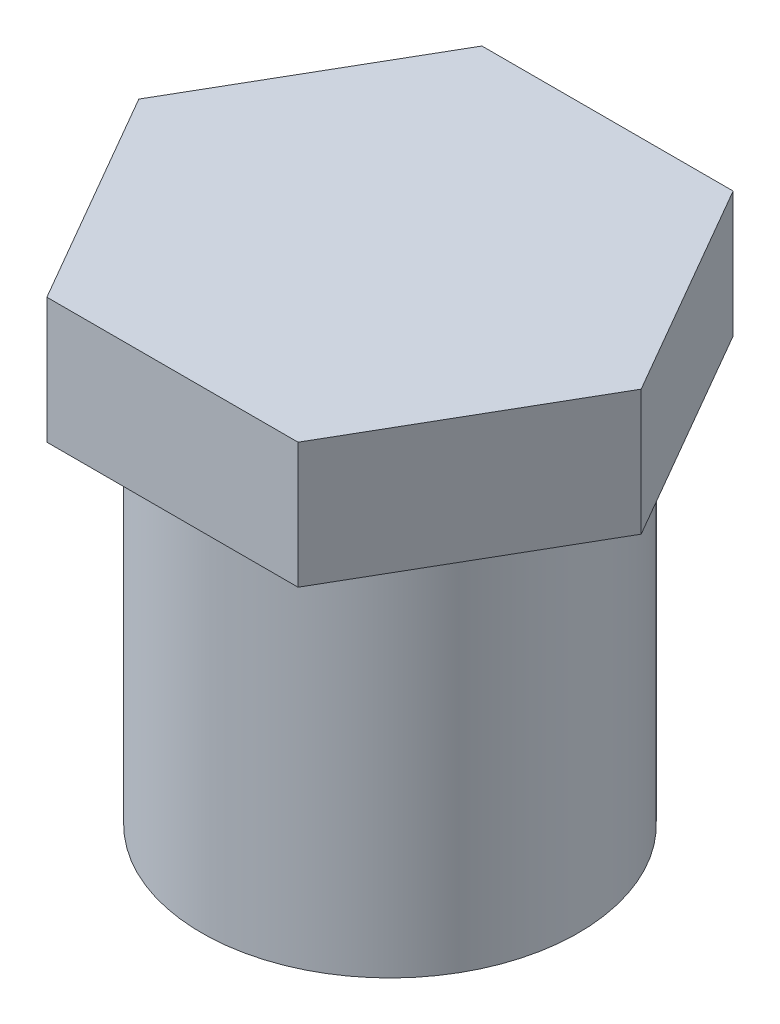
ISO-10303-21;
HEADER;
FILE_DESCRIPTION(('STEP AP214'),'2;1');
FILE_NAME('part.step','',(''),(''),'','','');
FILE_SCHEMA(('AUTOMOTIVE_DESIGN { 1 0 10303 214 1 1 1 1 }'));
ENDSEC;
DATA;
#1=APPLICATION_CONTEXT('core data for automotive mechanical design processes');
#2=APPLICATION_PROTOCOL_DEFINITION('international standard','automotive_design',2000,#1);
#3=PRODUCT_CONTEXT('',#1,'mechanical');
#4=PRODUCT('Part','Part','',(#3));
#5=PRODUCT_RELATED_PRODUCT_CATEGORY('part','',(#4));
#6=PRODUCT_DEFINITION_FORMATION('','',#4);
#7=PRODUCT_DEFINITION_CONTEXT('part definition',#1,'design');
#8=PRODUCT_DEFINITION('design','',#6,#7);
#9=PRODUCT_DEFINITION_SHAPE('','',#8);
#10=(LENGTH_UNIT() NAMED_UNIT(*) SI_UNIT(.MILLI.,.METRE.));
#11=(NAMED_UNIT(*) PLANE_ANGLE_UNIT() SI_UNIT($,.RADIAN.));
#12=(NAMED_UNIT(*) SI_UNIT($,.STERADIAN.) SOLID_ANGLE_UNIT());
#13=UNCERTAINTY_MEASURE_WITH_UNIT(LENGTH_MEASURE(1.E-05),#10,'distance_accuracy_value','');
#14=(GEOMETRIC_REPRESENTATION_CONTEXT(3) GLOBAL_UNCERTAINTY_ASSIGNED_CONTEXT((#13)) GLOBAL_UNIT_ASSIGNED_CONTEXT((#10,
#11,#12)) REPRESENTATION_CONTEXT('',''));
#15=CARTESIAN_POINT('',(0.,0.,0.));
#16=DIRECTION('',(0.,0.,1.));
#17=DIRECTION('',(1.,0.,0.));
#18=AXIS2_PLACEMENT_3D('',#15,#16,#17);
#19=CARTESIAN_POINT('',(0.,3.81,0.));
#20=DIRECTION('',(0.,-1.,0.));
#21=DIRECTION('',(0.,0.,-1.));
#22=AXIS2_PLACEMENT_3D('',#19,#20,#21);
#23=CYLINDRICAL_SURFACE('',#22,1.905);
#24=CARTESIAN_POINT('',(0.,3.81,0.));
#25=DIRECTION('',(0.,1.,0.));
#26=DIRECTION('',(0.,0.,1.));
#27=AXIS2_PLACEMENT_3D('',#24,#25,#26);
#28=CIRCLE('',#27,1.905);
#29=CARTESIAN_POINT('',(0.,3.81,-1.905));
#30=VERTEX_POINT('',#29);
#31=EDGE_CURVE('E11',#30,#30,#28,.T.);
#32=CARTESIAN_POINT('',(0.,0.,0.));
#33=DIRECTION('',(0.,1.,0.));
#34=DIRECTION('',(0.,0.,1.));
#35=AXIS2_PLACEMENT_3D('',#32,#33,#34);
#36=CIRCLE('',#35,1.905);
#37=CARTESIAN_POINT('',(0.,0.,-1.905));
#38=VERTEX_POINT('',#37);
#39=EDGE_CURVE('E46',#38,#38,#36,.T.);
#40=CARTESIAN_POINT('',(0.,3.81,-1.905));
#41=CARTESIAN_POINT('',(0.,3.7703125,-1.905));
#42=CARTESIAN_POINT('',(0.,3.730625,-1.905));
#43=CARTESIAN_POINT('',(0.,3.65125,-1.905));
#44=CARTESIAN_POINT('',(0.,3.6115625,-1.905));
#45=CARTESIAN_POINT('',(0.,3.5321875,-1.905));
#46=CARTESIAN_POINT('',(0.,3.4925,-1.905));
#47=CARTESIAN_POINT('',(0.,3.413125,-1.905));
#48=CARTESIAN_POINT('',(0.,3.3734375,-1.905));
#49=CARTESIAN_POINT('',(0.,3.2940625,-1.905));
#50=CARTESIAN_POINT('',(0.,3.254375,-1.905));
#51=CARTESIAN_POINT('',(0.,3.175,-1.905));
#52=CARTESIAN_POINT('',(0.,3.1353125,-1.905));
#53=CARTESIAN_POINT('',(0.,3.0559375,-1.905));
#54=CARTESIAN_POINT('',(0.,3.01625,-1.905));
#55=CARTESIAN_POINT('',(0.,2.936875,-1.905));
#56=CARTESIAN_POINT('',(0.,2.8971875,-1.905));
#57=CARTESIAN_POINT('',(0.,2.8178125,-1.905));
#58=CARTESIAN_POINT('',(0.,2.778125,-1.905));
#59=CARTESIAN_POINT('',(0.,2.69875,-1.905));
#60=CARTESIAN_POINT('',(0.,2.6590625,-1.905));
#61=CARTESIAN_POINT('',(0.,2.5796875,-1.905));
#62=CARTESIAN_POINT('',(0.,2.54,-1.905));
#63=CARTESIAN_POINT('',(0.,2.460625,-1.905));
#64=CARTESIAN_POINT('',(0.,2.4209375,-1.905));
#65=CARTESIAN_POINT('',(0.,2.3415625,-1.905));
#66=CARTESIAN_POINT('',(0.,2.301875,-1.905));
#67=CARTESIAN_POINT('',(0.,2.2225,-1.905));
#68=CARTESIAN_POINT('',(0.,2.1828125,-1.905));
#69=CARTESIAN_POINT('',(0.,2.1034375,-1.905));
#70=CARTESIAN_POINT('',(0.,2.06375,-1.905));
#71=CARTESIAN_POINT('',(0.,1.984375,-1.905));
#72=CARTESIAN_POINT('',(0.,1.9446875,-1.905));
#73=CARTESIAN_POINT('',(0.,1.8653125,-1.905));
#74=CARTESIAN_POINT('',(0.,1.825625,-1.905));
#75=CARTESIAN_POINT('',(0.,1.74625,-1.905));
#76=CARTESIAN_POINT('',(0.,1.7065625,-1.905));
#77=CARTESIAN_POINT('',(0.,1.6271875,-1.905));
#78=CARTESIAN_POINT('',(0.,1.5875,-1.905));
#79=CARTESIAN_POINT('',(0.,1.508125,-1.905));
#80=CARTESIAN_POINT('',(0.,1.4684375,-1.905));
#81=CARTESIAN_POINT('',(0.,1.3890625,-1.905));
#82=CARTESIAN_POINT('',(0.,1.349375,-1.905));
#83=CARTESIAN_POINT('',(0.,1.27,-1.905));
#84=CARTESIAN_POINT('',(0.,1.2303125,-1.905));
#85=CARTESIAN_POINT('',(0.,1.1509375,-1.905));
#86=CARTESIAN_POINT('',(0.,1.11125,-1.905));
#87=CARTESIAN_POINT('',(0.,1.031875,-1.905));
#88=CARTESIAN_POINT('',(0.,0.9921875,-1.905));
#89=CARTESIAN_POINT('',(0.,0.9128125,-1.905));
#90=CARTESIAN_POINT('',(0.,0.873125,-1.905));
#91=CARTESIAN_POINT('',(0.,0.79375,-1.905));
#92=CARTESIAN_POINT('',(0.,0.7540625,-1.905));
#93=CARTESIAN_POINT('',(0.,0.6746875,-1.905));
#94=CARTESIAN_POINT('',(0.,0.635,-1.905));
#95=CARTESIAN_POINT('',(0.,0.555625,-1.905));
#96=CARTESIAN_POINT('',(0.,0.5159375,-1.905));
#97=CARTESIAN_POINT('',(0.,0.4365625,-1.905));
#98=CARTESIAN_POINT('',(0.,0.396875,-1.905));
#99=CARTESIAN_POINT('',(0.,0.3175,-1.905));
#100=CARTESIAN_POINT('',(0.,0.2778125,-1.905));
#101=CARTESIAN_POINT('',(0.,0.1984375,-1.905));
#102=CARTESIAN_POINT('',(0.,0.15875,-1.905));
#103=CARTESIAN_POINT('',(0.,0.0793749999999999,-1.905));
#104=CARTESIAN_POINT('',(0.,0.0396874999999999,-1.905));
#105=CARTESIAN_POINT('',(0.,0.,-1.905));
#106=B_SPLINE_CURVE_WITH_KNOTS('',3,(#40,#41,#42,#43,#44,#45,#46,#47,#48,#49,#50,#51,#52,#53,
#54,#55,#56,#57,#58,#59,#60,#61,#62,#63,#64,#65,#66,#67,#68,#69,#70,#71,#72,#73,#74,#75,#76,#77,
#78,#79,#80,#81,#82,#83,#84,#85,#86,#87,#88,#89,#90,#91,#92,#93,#94,#95,#96,#97,#98,#99,#100,
#101,#102,#103,#104,#105),.UNSPECIFIED.,.F.,.F.,(4,2,2,2,2,2,2,2,2,2,2,2,2,2,2,2,2,2,2,2,2,2,2,
2,2,2,2,2,2,2,2,2,4),(0.,0.1190625,0.238125,0.3571875,0.47625,0.5953125,0.714375,0.8334375,
0.9525,1.0715625,1.190625,1.3096875,1.42875,1.5478125,1.666875,1.7859375,1.905,2.0240625,
2.143125,2.2621875,2.38125,2.5003125,2.619375,2.7384375,2.8575,2.9765625,3.095625,3.2146875,
3.33375,3.4528125,3.571875,3.6909375,3.81),.UNSPECIFIED.);
#107=EDGE_CURVE('BSEAM43',#30,#38,#106,.T.);
#108=ORIENTED_EDGE('',*,*,#31,.F.);
#109=ORIENTED_EDGE('',*,*,#39,.T.);
#110=ORIENTED_EDGE('',*,*,#107,.T.);
#111=ORIENTED_EDGE('',*,*,#107,.F.);
#112=EDGE_LOOP('',(#108,#110,#109,#111));
#113=FACE_BOUND('',#112,.T.);
#114=ADVANCED_FACE('F43',(#113),#23,.T.);
#115=CARTESIAN_POINT('',(0.,0.,0.));
#116=DIRECTION('',(0.,1.,0.));
#117=DIRECTION('',(0.,0.,1.));
#118=AXIS2_PLACEMENT_3D('',#115,#116,#117);
#119=PLANE('',#118);
#120=ORIENTED_EDGE('',*,*,#39,.F.);
#121=EDGE_LOOP('',(#120));
#122=FACE_BOUND('',#121,.T.);
#123=ADVANCED_FACE('F168',(#122),#119,.F.);
#124=CARTESIAN_POINT('',(2.54,5.08,0.));
#125=DIRECTION('',(-0.866025403784438,0.,0.5));
#126=DIRECTION('',(0.5,0.,0.866025403784439));
#127=AXIS2_PLACEMENT_3D('',#124,#125,#126);
#128=PLANE('',#127);
#129=DIRECTION('',(-0.5,0.,-0.866025403784439));
#130=VECTOR('',#129,1.);
#131=CARTESIAN_POINT('',(2.54,3.81,0.));
#132=LINE('',#131,#130);
#133=CARTESIAN_POINT('',(2.54,3.81,0.));
#134=VERTEX_POINT('',#133);
#135=CARTESIAN_POINT('',(1.27,3.81,-2.19970452561248));
#136=VERTEX_POINT('',#135);
#137=EDGE_CURVE('E133',#134,#136,#132,.T.);
#138=ORIENTED_EDGE('',*,*,#137,.T.);
#139=DIRECTION('',(0.,-1.,0.));
#140=VECTOR('',#139,1.);
#141=CARTESIAN_POINT('',(1.27,5.08,-2.19970452561248));
#142=LINE('',#141,#140);
#143=CARTESIAN_POINT('',(1.27,5.08,-2.19970452561248));
#144=VERTEX_POINT('',#143);
#145=EDGE_CURVE('E160',#144,#136,#142,.T.);
#146=ORIENTED_EDGE('',*,*,#145,.F.);
#147=DIRECTION('',(-0.5,0.,-0.866025403784439));
#148=VECTOR('',#147,1.);
#149=CARTESIAN_POINT('',(2.54,5.08,0.));
#150=LINE('',#149,#148);
#151=CARTESIAN_POINT('',(2.54,5.08,0.));
#152=VERTEX_POINT('',#151);
#153=EDGE_CURVE('E149',#152,#144,#150,.T.);
#154=ORIENTED_EDGE('',*,*,#153,.F.);
#155=DIRECTION('',(0.,-1.,0.));
#156=VECTOR('',#155,1.);
#157=CARTESIAN_POINT('',(2.54,5.08,0.));
#158=LINE('',#157,#156);
#159=EDGE_CURVE('E129',#152,#134,#158,.T.);
#160=ORIENTED_EDGE('',*,*,#159,.T.);
#161=EDGE_LOOP('',(#138,#146,#154,#160));
#162=FACE_BOUND('',#161,.T.);
#163=ADVANCED_FACE('F170',(#162),#128,.F.);
#164=CARTESIAN_POINT('',(1.27,5.08,-2.19970452561248));
#165=DIRECTION('',(0.,0.,1.));
#166=DIRECTION('',(1.,0.,0.));
#167=AXIS2_PLACEMENT_3D('',#164,#165,#166);
#168=PLANE('',#167);
#169=DIRECTION('',(-1.,0.,0.));
#170=VECTOR('',#169,1.);
#171=CARTESIAN_POINT('',(1.27,3.81,-2.19970452561248));
#172=LINE('',#171,#170);
#173=CARTESIAN_POINT('',(-1.27,3.81,-2.19970452561248));
#174=VERTEX_POINT('',#173);
#175=EDGE_CURVE('E137',#136,#174,#172,.T.);
#176=ORIENTED_EDGE('',*,*,#175,.T.);
#177=DIRECTION('',(0.,-1.,0.));
#178=VECTOR('',#177,1.);
#179=CARTESIAN_POINT('',(-1.27,5.08,-2.19970452561248));
#180=LINE('',#179,#178);
#181=CARTESIAN_POINT('',(-1.27,5.08,-2.19970452561248));
#182=VERTEX_POINT('',#181);
#183=EDGE_CURVE('E156',#182,#174,#180,.T.);
#184=ORIENTED_EDGE('',*,*,#183,.F.);
#185=DIRECTION('',(-1.,0.,0.));
#186=VECTOR('',#185,1.);
#187=CARTESIAN_POINT('',(1.27,5.08,-2.19970452561248));
#188=LINE('',#187,#186);
#189=EDGE_CURVE('E98',#144,#182,#188,.T.);
#190=ORIENTED_EDGE('',*,*,#189,.F.);
#191=ORIENTED_EDGE('',*,*,#145,.T.);
#192=EDGE_LOOP('',(#176,#184,#190,#191));
#193=FACE_BOUND('',#192,.T.);
#194=ADVANCED_FACE('F175',(#193),#168,.F.);
#195=CARTESIAN_POINT('',(-1.27,5.08,-2.19970452561248));
#196=DIRECTION('',(0.866025403784439,0.,0.5));
#197=DIRECTION('',(0.5,0.,-0.866025403784439));
#198=AXIS2_PLACEMENT_3D('',#195,#196,#197);
#199=PLANE('',#198);
#200=DIRECTION('',(-0.5,0.,0.866025403784439));
#201=VECTOR('',#200,1.);
#202=CARTESIAN_POINT('',(-1.27,3.81,-2.19970452561248));
#203=LINE('',#202,#201);
#204=CARTESIAN_POINT('',(-2.54,3.81,0.));
#205=VERTEX_POINT('',#204);
#206=EDGE_CURVE('E140',#174,#205,#203,.T.);
#207=ORIENTED_EDGE('',*,*,#206,.T.);
#208=DIRECTION('',(0.,-1.,0.));
#209=VECTOR('',#208,1.);
#210=CARTESIAN_POINT('',(-2.54,5.08,0.));
#211=LINE('',#210,#209);
#212=CARTESIAN_POINT('',(-2.54,5.08,0.));
#213=VERTEX_POINT('',#212);
#214=EDGE_CURVE('E122',#213,#205,#211,.T.);
#215=ORIENTED_EDGE('',*,*,#214,.F.);
#216=DIRECTION('',(-0.5,0.,0.866025403784439));
#217=VECTOR('',#216,1.);
#218=CARTESIAN_POINT('',(-1.27,5.08,-2.19970452561248));
#219=LINE('',#218,#217);
#220=EDGE_CURVE('E111',#182,#213,#219,.T.);
#221=ORIENTED_EDGE('',*,*,#220,.F.);
#222=ORIENTED_EDGE('',*,*,#183,.T.);
#223=EDGE_LOOP('',(#207,#215,#221,#222));
#224=FACE_BOUND('',#223,.T.);
#225=ADVANCED_FACE('F182',(#224),#199,.F.);
#226=CARTESIAN_POINT('',(-2.54,5.08,0.));
#227=DIRECTION('',(0.866025403784438,0.,-0.500000000000001));
#228=DIRECTION('',(-0.500000000000001,0.,-0.866025403784438));
#229=AXIS2_PLACEMENT_3D('',#226,#227,#228);
#230=PLANE('',#229);
#231=DIRECTION('',(0.500000000000001,0.,0.866025403784438));
#232=VECTOR('',#231,1.);
#233=CARTESIAN_POINT('',(-2.54,3.81,0.));
#234=LINE('',#233,#232);
#235=CARTESIAN_POINT('',(-1.27,3.81,2.19970452561247));
#236=VERTEX_POINT('',#235);
#237=EDGE_CURVE('E120',#205,#236,#234,.T.);
#238=ORIENTED_EDGE('',*,*,#237,.T.);
#239=DIRECTION('',(0.,-1.,0.));
#240=VECTOR('',#239,1.);
#241=CARTESIAN_POINT('',(-1.27,5.08,2.19970452561247));
#242=LINE('',#241,#240);
#243=CARTESIAN_POINT('',(-1.27,5.08,2.19970452561247));
#244=VERTEX_POINT('',#243);
#245=EDGE_CURVE('E117',#244,#236,#242,.T.);
#246=ORIENTED_EDGE('',*,*,#245,.F.);
#247=DIRECTION('',(0.500000000000001,0.,0.866025403784438));
#248=VECTOR('',#247,1.);
#249=CARTESIAN_POINT('',(-2.54,5.08,0.));
#250=LINE('',#249,#248);
#251=EDGE_CURVE('E105',#213,#244,#250,.T.);
#252=ORIENTED_EDGE('',*,*,#251,.F.);
#253=ORIENTED_EDGE('',*,*,#214,.T.);
#254=EDGE_LOOP('',(#238,#246,#252,#253));
#255=FACE_BOUND('',#254,.T.);
#256=ADVANCED_FACE('F118',(#255),#230,.F.);
#257=CARTESIAN_POINT('',(-1.27,5.08,2.19970452561247));
#258=DIRECTION('',(0.,0.,-1.));
#259=DIRECTION('',(-1.,0.,0.));
#260=AXIS2_PLACEMENT_3D('',#257,#258,#259);
#261=PLANE('',#260);
#262=DIRECTION('',(1.,0.,0.));
#263=VECTOR('',#262,1.);
#264=CARTESIAN_POINT('',(-1.27,3.81,2.19970452561247));
#265=LINE('',#264,#263);
#266=CARTESIAN_POINT('',(1.27,3.81,2.19970452561248));
#267=VERTEX_POINT('',#266);
#268=EDGE_CURVE('E83',#236,#267,#265,.T.);
#269=ORIENTED_EDGE('',*,*,#268,.T.);
#270=DIRECTION('',(0.,-1.,0.));
#271=VECTOR('',#270,1.);
#272=CARTESIAN_POINT('',(1.27,5.08,2.19970452561248));
#273=LINE('',#272,#271);
#274=CARTESIAN_POINT('',(1.27,5.08,2.19970452561248));
#275=VERTEX_POINT('',#274);
#276=EDGE_CURVE('E123',#275,#267,#273,.T.);
#277=ORIENTED_EDGE('',*,*,#276,.F.);
#278=DIRECTION('',(1.,0.,0.));
#279=VECTOR('',#278,1.);
#280=CARTESIAN_POINT('',(-1.27,5.08,2.19970452561247));
#281=LINE('',#280,#279);
#282=EDGE_CURVE('E109',#244,#275,#281,.T.);
#283=ORIENTED_EDGE('',*,*,#282,.F.);
#284=ORIENTED_EDGE('',*,*,#245,.T.);
#285=EDGE_LOOP('',(#269,#277,#283,#284));
#286=FACE_BOUND('',#285,.T.);
#287=ADVANCED_FACE('F125',(#286),#261,.F.);
#288=CARTESIAN_POINT('',(1.27,5.08,2.19970452561248));
#289=DIRECTION('',(-0.866025403784439,0.,-0.5));
#290=DIRECTION('',(-0.5,0.,0.866025403784439));
#291=AXIS2_PLACEMENT_3D('',#288,#289,#290);
#292=PLANE('',#291);
#293=DIRECTION('',(0.5,0.,-0.866025403784439));
#294=VECTOR('',#293,1.);
#295=CARTESIAN_POINT('',(1.27,3.81,2.19970452561248));
#296=LINE('',#295,#294);
#297=EDGE_CURVE('E89',#267,#134,#296,.T.);
#298=ORIENTED_EDGE('',*,*,#297,.T.);
#299=ORIENTED_EDGE('',*,*,#159,.F.);
#300=DIRECTION('',(0.5,0.,-0.866025403784439));
#301=VECTOR('',#300,1.);
#302=CARTESIAN_POINT('',(1.27,5.08,2.19970452561248));
#303=LINE('',#302,#301);
#304=EDGE_CURVE('E60',#275,#152,#303,.T.);
#305=ORIENTED_EDGE('',*,*,#304,.F.);
#306=ORIENTED_EDGE('',*,*,#276,.T.);
#307=EDGE_LOOP('',(#298,#299,#305,#306));
#308=FACE_BOUND('',#307,.T.);
#309=ADVANCED_FACE('F190',(#308),#292,.F.);
#310=CARTESIAN_POINT('',(0.,5.08,0.));
#311=DIRECTION('',(0.,1.,0.));
#312=DIRECTION('',(0.,0.,1.));
#313=AXIS2_PLACEMENT_3D('',#310,#311,#312);
#314=PLANE('',#313);
#315=ORIENTED_EDGE('',*,*,#153,.T.);
#316=ORIENTED_EDGE('',*,*,#189,.T.);
#317=ORIENTED_EDGE('',*,*,#220,.T.);
#318=ORIENTED_EDGE('',*,*,#251,.T.);
#319=ORIENTED_EDGE('',*,*,#282,.T.);
#320=ORIENTED_EDGE('',*,*,#304,.T.);
#321=EDGE_LOOP('',(#315,#316,#317,#318,#319,#320));
#322=FACE_BOUND('',#321,.T.);
#323=ADVANCED_FACE('F107',(#322),#314,.T.);
#324=CARTESIAN_POINT('',(0.,3.81,0.));
#325=DIRECTION('',(0.,1.,0.));
#326=DIRECTION('',(0.,0.,1.));
#327=AXIS2_PLACEMENT_3D('',#324,#325,#326);
#328=PLANE('',#327);
#329=ORIENTED_EDGE('',*,*,#31,.T.);
#330=EDGE_LOOP('',(#329));
#331=FACE_BOUND('',#330,.T.);
#332=ORIENTED_EDGE('',*,*,#137,.F.);
#333=ORIENTED_EDGE('',*,*,#297,.F.);
#334=ORIENTED_EDGE('',*,*,#268,.F.);
#335=ORIENTED_EDGE('',*,*,#237,.F.);
#336=ORIENTED_EDGE('',*,*,#206,.F.);
#337=ORIENTED_EDGE('',*,*,#175,.F.);
#338=EDGE_LOOP('',(#332,#333,#334,#335,#336,#337));
#339=FACE_BOUND('',#338,.T.);
#340=ADVANCED_FACE('F193',(#331,#339),#328,.F.);
#341=CLOSED_SHELL('',(#114,#123,#163,#194,#225,#256,#287,#309,#323,#340));
#342=MANIFOLD_SOLID_BREP('B2',#341);
#343=ADVANCED_BREP_SHAPE_REPRESENTATION('',(#18,#342),#14);
#344=SHAPE_DEFINITION_REPRESENTATION(#9,#343);
ENDSEC;
END-ISO-10303-21;
